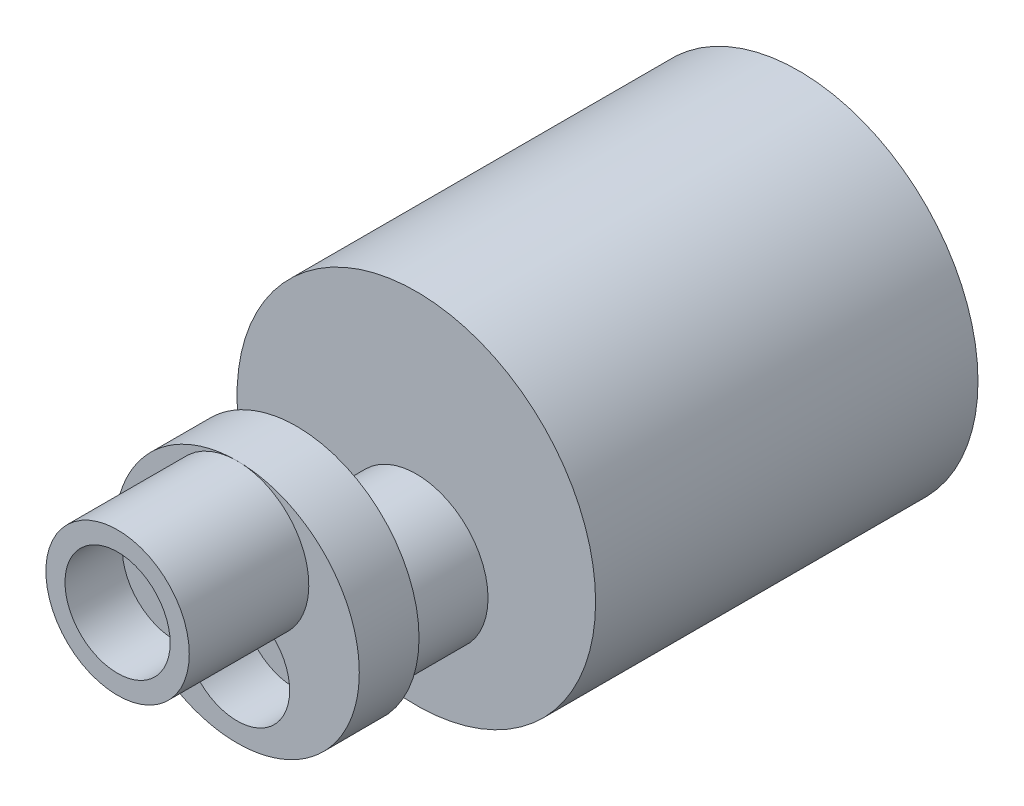
ISO-10303-21;
HEADER;
FILE_DESCRIPTION(('STEP AP214'),'2;1');
FILE_NAME('part.step','',(''),(''),'','','');
FILE_SCHEMA(('AUTOMOTIVE_DESIGN { 1 0 10303 214 1 1 1 1 }'));
ENDSEC;
DATA;
#1=APPLICATION_CONTEXT('core data for automotive mechanical design processes');
#2=APPLICATION_PROTOCOL_DEFINITION('international standard','automotive_design',2000,#1);
#3=PRODUCT_CONTEXT('',#1,'mechanical');
#4=PRODUCT('Part','Part','',(#3));
#5=PRODUCT_RELATED_PRODUCT_CATEGORY('part','',(#4));
#6=PRODUCT_DEFINITION_FORMATION('','',#4);
#7=PRODUCT_DEFINITION_CONTEXT('part definition',#1,'design');
#8=PRODUCT_DEFINITION('design','',#6,#7);
#9=PRODUCT_DEFINITION_SHAPE('','',#8);
#10=(LENGTH_UNIT() NAMED_UNIT(*) SI_UNIT(.MILLI.,.METRE.));
#11=(NAMED_UNIT(*) PLANE_ANGLE_UNIT() SI_UNIT($,.RADIAN.));
#12=(NAMED_UNIT(*) SI_UNIT($,.STERADIAN.) SOLID_ANGLE_UNIT());
#13=UNCERTAINTY_MEASURE_WITH_UNIT(LENGTH_MEASURE(1.E-05),#10,'distance_accuracy_value','');
#14=(GEOMETRIC_REPRESENTATION_CONTEXT(3) GLOBAL_UNCERTAINTY_ASSIGNED_CONTEXT((#13)) GLOBAL_UNIT_ASSIGNED_CONTEXT((#10,
#11,#12)) REPRESENTATION_CONTEXT('',''));
#15=CARTESIAN_POINT('',(0.,0.,0.));
#16=DIRECTION('',(0.,0.,1.));
#17=DIRECTION('',(1.,0.,0.));
#18=AXIS2_PLACEMENT_3D('',#15,#16,#17);
#19=CARTESIAN_POINT('',(0.,0.,16.));
#20=DIRECTION('',(0.,0.,-1.));
#21=DIRECTION('',(-1.,0.,0.));
#22=AXIS2_PLACEMENT_3D('',#19,#20,#21);
#23=CYLINDRICAL_SURFACE('',#22,7.5);
#24=CARTESIAN_POINT('',(0.,0.,16.));
#25=DIRECTION('',(0.,0.,1.));
#26=DIRECTION('',(1.,0.,0.));
#27=AXIS2_PLACEMENT_3D('',#24,#25,#26);
#28=CIRCLE('',#27,7.5);
#29=CARTESIAN_POINT('',(7.5,0.,16.));
#30=VERTEX_POINT('',#29);
#31=EDGE_CURVE('E47',#30,#30,#28,.T.);
#32=ORIENTED_EDGE('',*,*,#31,.F.);
#33=EDGE_LOOP('',(#32));
#34=FACE_BOUND('',#33,.T.);
#35=CARTESIAN_POINT('',(0.,0.,0.));
#36=DIRECTION('',(0.,0.,1.));
#37=DIRECTION('',(1.,0.,0.));
#38=AXIS2_PLACEMENT_3D('',#35,#36,#37);
#39=CIRCLE('',#38,7.5);
#40=CARTESIAN_POINT('',(7.5,0.,0.));
#41=VERTEX_POINT('',#40);
#42=EDGE_CURVE('E42',#41,#41,#39,.T.);
#43=ORIENTED_EDGE('',*,*,#42,.T.);
#44=EDGE_LOOP('',(#43));
#45=FACE_BOUND('',#44,.T.);
#46=ADVANCED_FACE('F39',(#34,#45),#23,.T.);
#47=CARTESIAN_POINT('',(0.,0.,16.));
#48=DIRECTION('',(0.,0.,1.));
#49=DIRECTION('',(1.,0.,0.));
#50=AXIS2_PLACEMENT_3D('',#47,#48,#49);
#51=PLANE('',#50);
#52=CARTESIAN_POINT('',(0.,-2.1125,16.));
#53=DIRECTION('',(0.,0.,1.));
#54=DIRECTION('',(1.,0.,0.));
#55=AXIS2_PLACEMENT_3D('',#52,#53,#54);
#56=CIRCLE('',#55,3.);
#57=CARTESIAN_POINT('',(3.,-2.1125,16.));
#58=VERTEX_POINT('',#57);
#59=EDGE_CURVE('E11',#58,#58,#56,.T.);
#60=ORIENTED_EDGE('',*,*,#59,.F.);
#61=EDGE_LOOP('',(#60));
#62=FACE_BOUND('',#61,.T.);
#63=ORIENTED_EDGE('',*,*,#31,.T.);
#64=EDGE_LOOP('',(#63));
#65=FACE_BOUND('',#64,.T.);
#66=ADVANCED_FACE('F122',(#62,#65),#51,.T.);
#67=CARTESIAN_POINT('',(0.,0.,0.));
#68=DIRECTION('',(0.,0.,1.));
#69=DIRECTION('',(1.,0.,0.));
#70=AXIS2_PLACEMENT_3D('',#67,#68,#69);
#71=PLANE('',#70);
#72=ORIENTED_EDGE('',*,*,#42,.F.);
#73=EDGE_LOOP('',(#72));
#74=FACE_BOUND('',#73,.T.);
#75=ADVANCED_FACE('F119',(#74),#71,.F.);
#76=CARTESIAN_POINT('',(0.,-2.1125,21.));
#77=DIRECTION('',(0.,0.,-1.));
#78=DIRECTION('',(-1.,0.,0.));
#79=AXIS2_PLACEMENT_3D('',#76,#77,#78);
#80=CYLINDRICAL_SURFACE('',#79,3.);
#81=CARTESIAN_POINT('',(0.,-2.1125,21.));
#82=DIRECTION('',(0.,0.,1.));
#83=DIRECTION('',(1.,0.,0.));
#84=AXIS2_PLACEMENT_3D('',#81,#82,#83);
#85=CIRCLE('',#84,3.);
#86=CARTESIAN_POINT('',(0.,-5.1125,21.));
#87=VERTEX_POINT('',#86);
#88=EDGE_CURVE('E60',#87,#87,#85,.T.);
#89=ORIENTED_EDGE('',*,*,#88,.F.);
#90=EDGE_LOOP('',(#89));
#91=FACE_BOUND('',#90,.T.);
#92=ORIENTED_EDGE('',*,*,#59,.T.);
#93=EDGE_LOOP('',(#92));
#94=FACE_BOUND('',#93,.T.);
#95=ADVANCED_FACE('F121',(#91,#94),#80,.T.);
#96=CARTESIAN_POINT('',(0.,0.,23.5));
#97=DIRECTION('',(0.,0.,-1.));
#98=DIRECTION('',(-1.,0.,0.));
#99=AXIS2_PLACEMENT_3D('',#96,#97,#98);
#100=CYLINDRICAL_SURFACE('',#99,5.1125);
#101=CARTESIAN_POINT('',(0.,0.,23.5));
#102=DIRECTION('',(0.,0.,1.));
#103=DIRECTION('',(1.,0.,0.));
#104=AXIS2_PLACEMENT_3D('',#101,#102,#103);
#105=CIRCLE('',#104,5.1125);
#106=CARTESIAN_POINT('',(0.,5.1125,23.5));
#107=VERTEX_POINT('',#106);
#108=EDGE_CURVE('E107',#107,#107,#105,.T.);
#109=ORIENTED_EDGE('',*,*,#108,.F.);
#110=EDGE_LOOP('',(#109));
#111=FACE_BOUND('',#110,.T.);
#112=CARTESIAN_POINT('',(0.,0.,21.));
#113=DIRECTION('',(0.,0.,1.));
#114=DIRECTION('',(1.,0.,0.));
#115=AXIS2_PLACEMENT_3D('',#112,#113,#114);
#116=CIRCLE('',#115,5.1125);
#117=EDGE_CURVE('E102',#87,#87,#116,.T.);
#118=ORIENTED_EDGE('',*,*,#117,.T.);
#119=EDGE_LOOP('',(#118));
#120=FACE_BOUND('',#119,.T.);
#121=ADVANCED_FACE('F128',(#111,#120),#100,.T.);
#122=CARTESIAN_POINT('',(0.,0.,23.5));
#123=DIRECTION('',(0.,0.,1.));
#124=DIRECTION('',(1.,0.,0.));
#125=AXIS2_PLACEMENT_3D('',#122,#123,#124);
#126=PLANE('',#125);
#127=CARTESIAN_POINT('',(0.,-2.1125,23.5));
#128=DIRECTION('',(0.,0.,1.));
#129=DIRECTION('',(1.,0.,0.));
#130=AXIS2_PLACEMENT_3D('',#127,#128,#129);
#131=CIRCLE('',#130,2.2);
#132=CARTESIAN_POINT('',(-1.4882798413251,-0.492307692307693,23.5));
#133=VERTEX_POINT('',#132);
#134=CARTESIAN_POINT('',(1.4882798413251,-0.492307692307693,23.5));
#135=VERTEX_POINT('',#134);
#136=EDGE_CURVE('E280',#133,#135,#131,.T.);
#137=ORIENTED_EDGE('',*,*,#136,.F.);
#138=CARTESIAN_POINT('',(0.,2.1125,23.5));
#139=DIRECTION('',(0.,0.,1.));
#140=DIRECTION('',(1.,0.,0.));
#141=AXIS2_PLACEMENT_3D('',#138,#139,#140);
#142=CIRCLE('',#141,3.);
#143=EDGE_CURVE('E103',#107,#133,#142,.T.);
#144=ORIENTED_EDGE('',*,*,#143,.F.);
#145=ORIENTED_EDGE('',*,*,#108,.T.);
#146=EDGE_CURVE('E98',#135,#107,#142,.T.);
#147=ORIENTED_EDGE('',*,*,#146,.F.);
#148=EDGE_LOOP('',(#137,#144,#145,#147));
#149=FACE_BOUND('',#148,.T.);
#150=ADVANCED_FACE('F161',(#149),#126,.T.);
#151=CARTESIAN_POINT('',(0.,0.,21.));
#152=DIRECTION('',(0.,0.,1.));
#153=DIRECTION('',(1.,0.,0.));
#154=AXIS2_PLACEMENT_3D('',#151,#152,#153);
#155=PLANE('',#154);
#156=CARTESIAN_POINT('',(0.,2.1125,21.));
#157=DIRECTION('',(0.,0.,1.));
#158=DIRECTION('',(1.,0.,0.));
#159=AXIS2_PLACEMENT_3D('',#156,#157,#158);
#160=CIRCLE('',#159,1.2);
#161=CARTESIAN_POINT('',(1.2,2.1125,21.));
#162=VERTEX_POINT('',#161);
#163=EDGE_CURVE('E95',#162,#162,#160,.T.);
#164=ORIENTED_EDGE('',*,*,#163,.T.);
#165=EDGE_LOOP('',(#164));
#166=FACE_BOUND('',#165,.T.);
#167=ORIENTED_EDGE('',*,*,#117,.F.);
#168=ORIENTED_EDGE('',*,*,#88,.T.);
#169=EDGE_LOOP('',(#167,#168));
#170=FACE_BOUND('',#169,.T.);
#171=ADVANCED_FACE('F172',(#166,#170),#155,.F.);
#172=CARTESIAN_POINT('',(0.,2.1125,28.5));
#173=DIRECTION('',(0.,0.,-1.));
#174=DIRECTION('',(-1.,0.,0.));
#175=AXIS2_PLACEMENT_3D('',#172,#173,#174);
#176=CYLINDRICAL_SURFACE('',#175,3.);
#177=CARTESIAN_POINT('',(0.,2.1125,28.5));
#178=DIRECTION('',(0.,0.,1.));
#179=DIRECTION('',(1.,0.,0.));
#180=AXIS2_PLACEMENT_3D('',#177,#178,#179);
#181=CIRCLE('',#180,3.);
#182=CARTESIAN_POINT('',(3.,2.1125,28.5));
#183=VERTEX_POINT('',#182);
#184=EDGE_CURVE('E99',#183,#183,#181,.T.);
#185=ORIENTED_EDGE('',*,*,#184,.F.);
#186=EDGE_LOOP('',(#185));
#187=FACE_BOUND('',#186,.T.);
#188=ORIENTED_EDGE('',*,*,#143,.T.);
#189=EDGE_CURVE('E106',#133,#135,#142,.T.);
#190=ORIENTED_EDGE('',*,*,#189,.T.);
#191=ORIENTED_EDGE('',*,*,#146,.T.);
#192=EDGE_LOOP('',(#188,#190,#191));
#193=FACE_BOUND('',#192,.T.);
#194=ADVANCED_FACE('F183',(#187,#193),#176,.T.);
#195=CARTESIAN_POINT('',(0.,2.1125,28.5));
#196=DIRECTION('',(0.,0.,1.));
#197=DIRECTION('',(1.,0.,0.));
#198=AXIS2_PLACEMENT_3D('',#195,#196,#197);
#199=PLANE('',#198);
#200=CARTESIAN_POINT('',(0.,2.1125,28.5));
#201=DIRECTION('',(0.,0.,1.));
#202=DIRECTION('',(1.,0.,0.));
#203=AXIS2_PLACEMENT_3D('',#200,#201,#202);
#204=CIRCLE('',#203,2.2);
#205=CARTESIAN_POINT('',(2.2,2.1125,28.5));
#206=VERTEX_POINT('',#205);
#207=EDGE_CURVE('E79',#206,#206,#204,.T.);
#208=ORIENTED_EDGE('',*,*,#207,.F.);
#209=EDGE_LOOP('',(#208));
#210=FACE_BOUND('',#209,.T.);
#211=ORIENTED_EDGE('',*,*,#184,.T.);
#212=EDGE_LOOP('',(#211));
#213=FACE_BOUND('',#212,.T.);
#214=ADVANCED_FACE('F193',(#210,#213),#199,.T.);
#215=CARTESIAN_POINT('',(0.,2.1125,28.5));
#216=DIRECTION('',(0.,0.,1.));
#217=DIRECTION('',(1.,0.,0.));
#218=AXIS2_PLACEMENT_3D('',#215,#216,#217);
#219=CYLINDRICAL_SURFACE('',#218,1.2);
#220=ORIENTED_EDGE('',*,*,#163,.F.);
#221=EDGE_LOOP('',(#220));
#222=FACE_BOUND('',#221,.T.);
#223=CARTESIAN_POINT('',(0.,2.1125,26.1));
#224=DIRECTION('',(0.,0.,1.));
#225=DIRECTION('',(1.,0.,0.));
#226=AXIS2_PLACEMENT_3D('',#223,#224,#225);
#227=CIRCLE('',#226,1.2);
#228=CARTESIAN_POINT('',(1.2,2.1125,26.1));
#229=VERTEX_POINT('',#228);
#230=EDGE_CURVE('E92',#229,#229,#227,.T.);
#231=ORIENTED_EDGE('',*,*,#230,.T.);
#232=EDGE_LOOP('',(#231));
#233=FACE_BOUND('',#232,.T.);
#234=ADVANCED_FACE('F203',(#222,#233),#219,.F.);
#235=CARTESIAN_POINT('',(1.2,2.1125,26.1));
#236=DIRECTION('',(0.,0.,-1.));
#237=DIRECTION('',(-1.,0.,0.));
#238=AXIS2_PLACEMENT_3D('',#235,#236,#237);
#239=PLANE('',#238);
#240=ORIENTED_EDGE('',*,*,#230,.F.);
#241=EDGE_LOOP('',(#240));
#242=FACE_BOUND('',#241,.T.);
#243=CARTESIAN_POINT('',(0.,2.1125,26.1));
#244=DIRECTION('',(0.,0.,1.));
#245=DIRECTION('',(1.,0.,0.));
#246=AXIS2_PLACEMENT_3D('',#243,#244,#245);
#247=CIRCLE('',#246,2.2);
#248=CARTESIAN_POINT('',(2.2,2.1125,26.1));
#249=VERTEX_POINT('',#248);
#250=EDGE_CURVE('E83',#249,#249,#247,.T.);
#251=ORIENTED_EDGE('',*,*,#250,.T.);
#252=EDGE_LOOP('',(#251));
#253=FACE_BOUND('',#252,.T.);
#254=ADVANCED_FACE('F213',(#242,#253),#239,.F.);
#255=CARTESIAN_POINT('',(0.,2.1125,28.5));
#256=DIRECTION('',(0.,0.,1.));
#257=DIRECTION('',(1.,0.,0.));
#258=AXIS2_PLACEMENT_3D('',#255,#256,#257);
#259=CYLINDRICAL_SURFACE('',#258,2.2);
#260=ORIENTED_EDGE('',*,*,#250,.F.);
#261=EDGE_LOOP('',(#260));
#262=FACE_BOUND('',#261,.T.);
#263=ORIENTED_EDGE('',*,*,#207,.T.);
#264=EDGE_LOOP('',(#263));
#265=FACE_BOUND('',#264,.T.);
#266=ADVANCED_FACE('F223',(#262,#265),#259,.F.);
#267=CARTESIAN_POINT('',(2.2,-2.1125,23.5));
#268=DIRECTION('',(0.,0.,1.));
#269=DIRECTION('',(1.,0.,0.));
#270=AXIS2_PLACEMENT_3D('',#267,#268,#269);
#271=PLANE('',#270);
#272=EDGE_CURVE('E54',#135,#133,#131,.T.);
#273=ORIENTED_EDGE('',*,*,#272,.F.);
#274=ORIENTED_EDGE('',*,*,#189,.F.);
#275=EDGE_LOOP('',(#273,#274));
#276=FACE_BOUND('',#275,.T.);
#277=ADVANCED_FACE('F73',(#276),#271,.F.);
#278=CARTESIAN_POINT('',(0.,-2.1125,9.5));
#279=DIRECTION('',(0.,0.,1.));
#280=DIRECTION('',(1.,0.,0.));
#281=AXIS2_PLACEMENT_3D('',#278,#279,#280);
#282=CONICAL_SURFACE('',#281,1.2,1.02974425867665);
#283=CARTESIAN_POINT('',(0.,-2.1125,8.77896725716693));
#284=VERTEX_POINT('',#283);
#285=VERTEX_LOOP('',#284);
#286=FACE_BOUND('',#285,.T.);
#287=CARTESIAN_POINT('',(0.,-2.1125,9.5));
#288=DIRECTION('',(0.,0.,1.));
#289=DIRECTION('',(1.,0.,0.));
#290=AXIS2_PLACEMENT_3D('',#287,#288,#289);
#291=CIRCLE('',#290,1.2);
#292=CARTESIAN_POINT('',(1.2,-2.1125,9.5));
#293=VERTEX_POINT('',#292);
#294=EDGE_CURVE('E77',#293,#293,#291,.T.);
#295=ORIENTED_EDGE('',*,*,#294,.T.);
#296=EDGE_LOOP('',(#295));
#297=FACE_BOUND('',#296,.T.);
#298=ADVANCED_FACE('F69',(#286,#297),#282,.F.);
#299=CARTESIAN_POINT('',(0.,-2.1125,23.5));
#300=DIRECTION('',(0.,0.,1.));
#301=DIRECTION('',(1.,0.,0.));
#302=AXIS2_PLACEMENT_3D('',#299,#300,#301);
#303=CYLINDRICAL_SURFACE('',#302,1.2);
#304=ORIENTED_EDGE('',*,*,#294,.F.);
#305=EDGE_LOOP('',(#304));
#306=FACE_BOUND('',#305,.T.);
#307=CARTESIAN_POINT('',(0.,-2.1125,21.1));
#308=DIRECTION('',(0.,0.,1.));
#309=DIRECTION('',(1.,0.,0.));
#310=AXIS2_PLACEMENT_3D('',#307,#308,#309);
#311=CIRCLE('',#310,1.2);
#312=CARTESIAN_POINT('',(1.2,-2.1125,21.1));
#313=VERTEX_POINT('',#312);
#314=EDGE_CURVE('E80',#313,#313,#311,.T.);
#315=ORIENTED_EDGE('',*,*,#314,.T.);
#316=EDGE_LOOP('',(#315));
#317=FACE_BOUND('',#316,.T.);
#318=ADVANCED_FACE('F72',(#306,#317),#303,.F.);
#319=CARTESIAN_POINT('',(1.2,-2.1125,21.1));
#320=DIRECTION('',(0.,0.,-1.));
#321=DIRECTION('',(-1.,0.,0.));
#322=AXIS2_PLACEMENT_3D('',#319,#320,#321);
#323=PLANE('',#322);
#324=ORIENTED_EDGE('',*,*,#314,.F.);
#325=EDGE_LOOP('',(#324));
#326=FACE_BOUND('',#325,.T.);
#327=CARTESIAN_POINT('',(0.,-2.1125,21.1));
#328=DIRECTION('',(0.,0.,1.));
#329=DIRECTION('',(1.,0.,0.));
#330=AXIS2_PLACEMENT_3D('',#327,#328,#329);
#331=CIRCLE('',#330,2.2);
#332=CARTESIAN_POINT('',(2.2,-2.1125,21.1));
#333=VERTEX_POINT('',#332);
#334=EDGE_CURVE('E86',#333,#333,#331,.T.);
#335=ORIENTED_EDGE('',*,*,#334,.T.);
#336=EDGE_LOOP('',(#335));
#337=FACE_BOUND('',#336,.T.);
#338=ADVANCED_FACE('F254',(#326,#337),#323,.F.);
#339=CARTESIAN_POINT('',(0.,-2.1125,23.5));
#340=DIRECTION('',(0.,0.,1.));
#341=DIRECTION('',(1.,0.,0.));
#342=AXIS2_PLACEMENT_3D('',#339,#340,#341);
#343=CYLINDRICAL_SURFACE('',#342,2.2);
#344=ORIENTED_EDGE('',*,*,#334,.F.);
#345=EDGE_LOOP('',(#344));
#346=FACE_BOUND('',#345,.T.);
#347=ORIENTED_EDGE('',*,*,#272,.T.);
#348=ORIENTED_EDGE('',*,*,#136,.T.);
#349=EDGE_LOOP('',(#347,#348));
#350=FACE_BOUND('',#349,.T.);
#351=ADVANCED_FACE('F263',(#346,#350),#343,.F.);
#352=CLOSED_SHELL('',(#46,#66,#75,#95,#121,#150,#171,#194,#214,#234,#254,#266,#277,#298,#318,
#338,#351));
#353=MANIFOLD_SOLID_BREP('B2',#352);
#354=ADVANCED_BREP_SHAPE_REPRESENTATION('',(#18,#353),#14);
#355=SHAPE_DEFINITION_REPRESENTATION(#9,#354);
ENDSEC;
END-ISO-10303-21;
